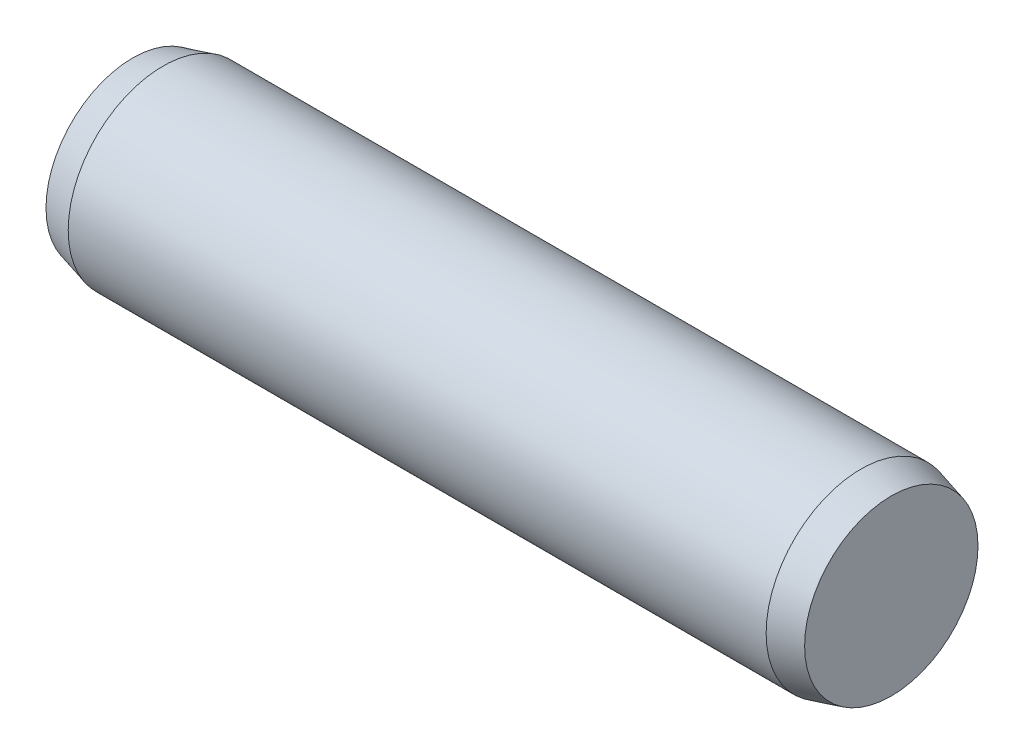
ISO-10303-21;
HEADER;
FILE_DESCRIPTION(('STEP AP214'),'2;1');
FILE_NAME('part.step','',(''),(''),'','','');
FILE_SCHEMA(('AUTOMOTIVE_DESIGN { 1 0 10303 214 1 1 1 1 }'));
ENDSEC;
DATA;
#1=APPLICATION_CONTEXT('core data for automotive mechanical design processes');
#2=APPLICATION_PROTOCOL_DEFINITION('international standard','automotive_design',2000,#1);
#3=PRODUCT_CONTEXT('',#1,'mechanical');
#4=PRODUCT('Part','Part','',(#3));
#5=PRODUCT_RELATED_PRODUCT_CATEGORY('part','',(#4));
#6=PRODUCT_DEFINITION_FORMATION('','',#4);
#7=PRODUCT_DEFINITION_CONTEXT('part definition',#1,'design');
#8=PRODUCT_DEFINITION('design','',#6,#7);
#9=PRODUCT_DEFINITION_SHAPE('','',#8);
#10=(LENGTH_UNIT() NAMED_UNIT(*) SI_UNIT(.MILLI.,.METRE.));
#11=(NAMED_UNIT(*) PLANE_ANGLE_UNIT() SI_UNIT($,.RADIAN.));
#12=(NAMED_UNIT(*) SI_UNIT($,.STERADIAN.) SOLID_ANGLE_UNIT());
#13=UNCERTAINTY_MEASURE_WITH_UNIT(LENGTH_MEASURE(1.E-05),#10,'distance_accuracy_value','');
#14=(GEOMETRIC_REPRESENTATION_CONTEXT(3) GLOBAL_UNCERTAINTY_ASSIGNED_CONTEXT((#13)) GLOBAL_UNIT_ASSIGNED_CONTEXT((#10,
#11,#12)) REPRESENTATION_CONTEXT('',''));
#15=CARTESIAN_POINT('',(0.,0.,0.));
#16=DIRECTION('',(0.,0.,1.));
#17=DIRECTION('',(1.,0.,0.));
#18=AXIS2_PLACEMENT_3D('',#15,#16,#17);
#19=CARTESIAN_POINT('',(0.,11.4282032302755,0.));
#20=DIRECTION('',(1.,0.,0.));
#21=DIRECTION('',(0.,0.,-1.));
#22=AXIS2_PLACEMENT_3D('',#19,#20,#21);
#23=PLANE('',#22);
#24=CARTESIAN_POINT('',(0.,0.,0.));
#25=DIRECTION('',(-1.,0.,0.));
#26=DIRECTION('',(0.,0.,1.));
#27=AXIS2_PLACEMENT_3D('',#24,#25,#26);
#28=CIRCLE('',#27,11.4282032302755);
#29=CARTESIAN_POINT('',(0.,0.,11.4282032302755));
#30=VERTEX_POINT('',#29);
#31=EDGE_CURVE('E48',#30,#30,#28,.T.);
#32=ORIENTED_EDGE('',*,*,#31,.T.);
#33=EDGE_LOOP('',(#32));
#34=FACE_BOUND('',#33,.T.);
#35=ADVANCED_FACE('F34',(#34),#23,.F.);
#36=CARTESIAN_POINT('',(100.,0.,0.));
#37=DIRECTION('',(-1.,0.,0.));
#38=DIRECTION('',(0.,0.,1.));
#39=AXIS2_PLACEMENT_3D('',#36,#37,#38);
#40=PLANE('',#39);
#41=CARTESIAN_POINT('',(100.,0.,0.));
#42=DIRECTION('',(-1.,0.,0.));
#43=DIRECTION('',(0.,0.,1.));
#44=AXIS2_PLACEMENT_3D('',#41,#42,#43);
#45=CIRCLE('',#44,11.4282032302755);
#46=CARTESIAN_POINT('',(100.,0.,11.4282032302755));
#47=VERTEX_POINT('',#46);
#48=EDGE_CURVE('E10',#47,#47,#45,.T.);
#49=ORIENTED_EDGE('',*,*,#48,.F.);
#50=EDGE_LOOP('',(#49));
#51=FACE_BOUND('',#50,.T.);
#52=ADVANCED_FACE('F68',(#51),#40,.F.);
#53=CARTESIAN_POINT('',(100.,0.,0.));
#54=DIRECTION('',(-1.,0.,0.));
#55=DIRECTION('',(0.,0.,1.));
#56=AXIS2_PLACEMENT_3D('',#53,#54,#55);
#57=CONICAL_SURFACE('',#56,11.4282032302755,0.26179938779915);
#58=CARTESIAN_POINT('',(96.,0.,0.));
#59=DIRECTION('',(-1.,0.,0.));
#60=DIRECTION('',(0.,0.,1.));
#61=AXIS2_PLACEMENT_3D('',#58,#59,#60);
#62=CIRCLE('',#61,12.5);
#63=CARTESIAN_POINT('',(96.,0.,12.5));
#64=VERTEX_POINT('',#63);
#65=EDGE_CURVE('E40',#64,#64,#62,.T.);
#66=ORIENTED_EDGE('',*,*,#65,.F.);
#67=EDGE_LOOP('',(#66));
#68=FACE_BOUND('',#67,.T.);
#69=ORIENTED_EDGE('',*,*,#48,.T.);
#70=EDGE_LOOP('',(#69));
#71=FACE_BOUND('',#70,.T.);
#72=ADVANCED_FACE('F63',(#68,#71),#57,.T.);
#73=CARTESIAN_POINT('',(-6.35,0.,0.));
#74=DIRECTION('',(-1.,0.,0.));
#75=DIRECTION('',(0.,0.,1.));
#76=AXIS2_PLACEMENT_3D('',#73,#74,#75);
#77=CYLINDRICAL_SURFACE('',#76,12.5);
#78=CARTESIAN_POINT('',(4.,0.,0.));
#79=DIRECTION('',(-1.,0.,0.));
#80=DIRECTION('',(0.,0.,1.));
#81=AXIS2_PLACEMENT_3D('',#78,#79,#80);
#82=CIRCLE('',#81,12.5);
#83=CARTESIAN_POINT('',(4.,0.,12.5));
#84=VERTEX_POINT('',#83);
#85=EDGE_CURVE('E44',#84,#84,#82,.T.);
#86=ORIENTED_EDGE('',*,*,#85,.F.);
#87=EDGE_LOOP('',(#86));
#88=FACE_BOUND('',#87,.T.);
#89=ORIENTED_EDGE('',*,*,#65,.T.);
#90=EDGE_LOOP('',(#89));
#91=FACE_BOUND('',#90,.T.);
#92=ADVANCED_FACE('F58',(#88,#91),#77,.T.);
#93=CARTESIAN_POINT('',(4.,0.,0.));
#94=DIRECTION('',(1.,0.,0.));
#95=DIRECTION('',(0.,0.,-1.));
#96=AXIS2_PLACEMENT_3D('',#93,#94,#95);
#97=CONICAL_SURFACE('',#96,12.5,0.261799387799143);
#98=ORIENTED_EDGE('',*,*,#31,.F.);
#99=EDGE_LOOP('',(#98));
#100=FACE_BOUND('',#99,.T.);
#101=ORIENTED_EDGE('',*,*,#85,.T.);
#102=EDGE_LOOP('',(#101));
#103=FACE_BOUND('',#102,.T.);
#104=ADVANCED_FACE('F55',(#100,#103),#97,.T.);
#105=CLOSED_SHELL('',(#35,#52,#72,#92,#104));
#106=MANIFOLD_SOLID_BREP('B2',#105);
#107=ADVANCED_BREP_SHAPE_REPRESENTATION('',(#18,#106),#14);
#108=SHAPE_DEFINITION_REPRESENTATION(#9,#107);
ENDSEC;
END-ISO-10303-21;
